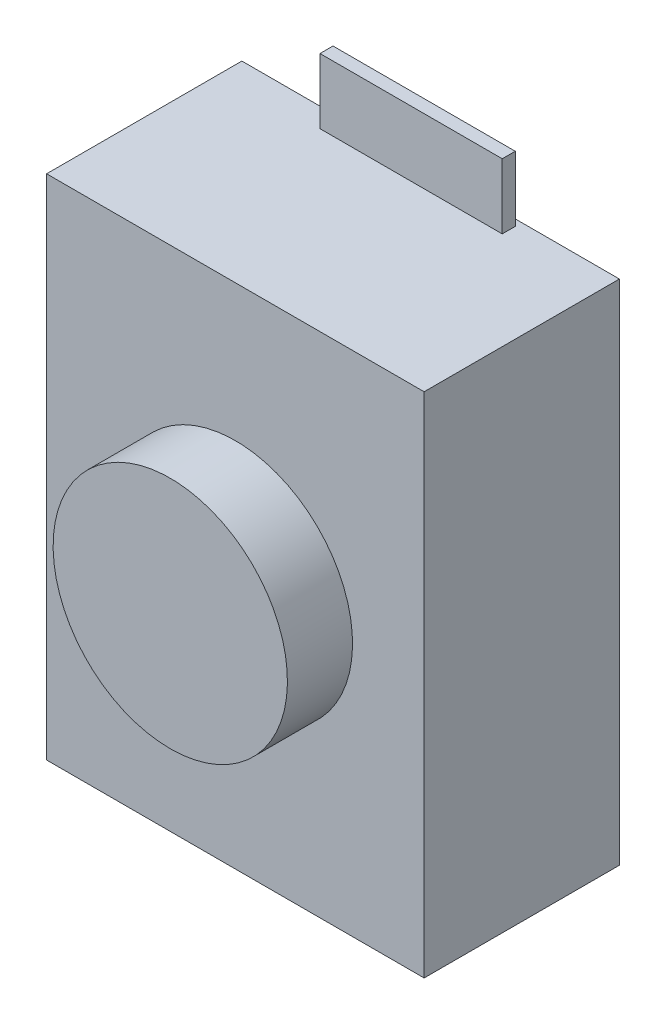
ISO-10303-21;
HEADER;
FILE_DESCRIPTION(('STEP AP214'),'2;1');
FILE_NAME('part.step','',(''),(''),'','','');
FILE_SCHEMA(('AUTOMOTIVE_DESIGN { 1 0 10303 214 1 1 1 1 }'));
ENDSEC;
DATA;
#1=APPLICATION_CONTEXT('core data for automotive mechanical design processes');
#2=APPLICATION_PROTOCOL_DEFINITION('international standard','automotive_design',2000,#1);
#3=PRODUCT_CONTEXT('',#1,'mechanical');
#4=PRODUCT('Part','Part','',(#3));
#5=PRODUCT_RELATED_PRODUCT_CATEGORY('part','',(#4));
#6=PRODUCT_DEFINITION_FORMATION('','',#4);
#7=PRODUCT_DEFINITION_CONTEXT('part definition',#1,'design');
#8=PRODUCT_DEFINITION('design','',#6,#7);
#9=PRODUCT_DEFINITION_SHAPE('','',#8);
#10=(LENGTH_UNIT() NAMED_UNIT(*) SI_UNIT(.MILLI.,.METRE.));
#11=(NAMED_UNIT(*) PLANE_ANGLE_UNIT() SI_UNIT($,.RADIAN.));
#12=(NAMED_UNIT(*) SI_UNIT($,.STERADIAN.) SOLID_ANGLE_UNIT());
#13=UNCERTAINTY_MEASURE_WITH_UNIT(LENGTH_MEASURE(1.E-05),#10,'distance_accuracy_value','');
#14=(GEOMETRIC_REPRESENTATION_CONTEXT(3) GLOBAL_UNCERTAINTY_ASSIGNED_CONTEXT((#13)) GLOBAL_UNIT_ASSIGNED_CONTEXT((#10,
#11,#12)) REPRESENTATION_CONTEXT('',''));
#15=CARTESIAN_POINT('',(0.,0.,0.));
#16=DIRECTION('',(0.,0.,1.));
#17=DIRECTION('',(1.,0.,0.));
#18=AXIS2_PLACEMENT_3D('',#15,#16,#17);
#19=CARTESIAN_POINT('',(56.15,-12.776,3.2));
#20=DIRECTION('',(0.,1.,0.));
#21=DIRECTION('',(1.,0.,0.));
#22=AXIS2_PLACEMENT_3D('',#19,#20,#21);
#23=PLANE('',#22);
#24=DIRECTION('',(0.,0.,1.));
#25=VECTOR('',#24,1.);
#26=CARTESIAN_POINT('',(59.05000000001,-12.77600000001,1.70000000001));
#27=LINE('',#26,#25);
#28=CARTESIAN_POINT('',(59.05,-12.776,1.7));
#29=VERTEX_POINT('',#28);
#30=CARTESIAN_POINT('',(59.05,-12.776,3.2));
#31=VERTEX_POINT('',#30);
#32=EDGE_CURVE('E11',#29,#31,#27,.T.);
#33=ORIENTED_EDGE('',*,*,#32,.T.);
#34=DIRECTION('',(-1.,0.,0.));
#35=VECTOR('',#34,1.);
#36=CARTESIAN_POINT('',(59.05000000001,-12.77600000001,3.20000000001));
#37=LINE('',#36,#35);
#38=CARTESIAN_POINT('',(56.15,-12.776,3.2));
#39=VERTEX_POINT('',#38);
#40=EDGE_CURVE('E28',#31,#39,#37,.T.);
#41=ORIENTED_EDGE('',*,*,#40,.T.);
#42=DIRECTION('',(0.,0.,1.));
#43=VECTOR('',#42,1.);
#44=CARTESIAN_POINT('',(56.15000000001,-12.77600000001,1.70000000001));
#45=LINE('',#44,#43);
#46=CARTESIAN_POINT('',(56.15,-12.776,1.7));
#47=VERTEX_POINT('',#46);
#48=EDGE_CURVE('E233',#47,#39,#45,.T.);
#49=ORIENTED_EDGE('',*,*,#48,.F.);
#50=DIRECTION('',(-1.,0.,0.));
#51=VECTOR('',#50,1.);
#52=CARTESIAN_POINT('',(59.05000000001,-12.77600000001,1.70000000001));
#53=LINE('',#52,#51);
#54=EDGE_CURVE('E133',#29,#47,#53,.T.);
#55=ORIENTED_EDGE('',*,*,#54,.F.);
#56=EDGE_LOOP('',(#33,#41,#49,#55));
#57=FACE_BOUND('',#56,.T.);
#58=DIRECTION('',(1.,0.,0.));
#59=VECTOR('',#58,1.);
#60=CARTESIAN_POINT('',(56.90000000001,-12.77600000001,1.75000000001));
#61=LINE('',#60,#59);
#62=CARTESIAN_POINT('',(56.9,-12.776,1.75));
#63=VERTEX_POINT('',#62);
#64=CARTESIAN_POINT('',(58.3,-12.776,1.75));
#65=VERTEX_POINT('',#64);
#66=EDGE_CURVE('E21',#63,#65,#61,.T.);
#67=ORIENTED_EDGE('',*,*,#66,.F.);
#68=DIRECTION('',(-1.00071054263569E-10,0.,1.));
#69=VECTOR('',#68,1.);
#70=CARTESIAN_POINT('',(56.90000000001,-12.77600000001,1.75000000001));
#71=LINE('',#70,#69);
#72=CARTESIAN_POINT('',(56.9,-12.776,1.85));
#73=VERTEX_POINT('',#72);
#74=EDGE_CURVE('E215',#63,#73,#71,.T.);
#75=ORIENTED_EDGE('',*,*,#74,.T.);
#76=DIRECTION('',(1.,0.,0.));
#77=VECTOR('',#76,1.);
#78=CARTESIAN_POINT('',(56.90000000001,-12.77600000001,1.85000000001));
#79=LINE('',#78,#77);
#80=CARTESIAN_POINT('',(58.3,-12.776,1.85));
#81=VERTEX_POINT('',#80);
#82=EDGE_CURVE('E211',#73,#81,#79,.T.);
#83=ORIENTED_EDGE('',*,*,#82,.T.);
#84=DIRECTION('',(-1.00071054263569E-10,0.,1.));
#85=VECTOR('',#84,1.);
#86=CARTESIAN_POINT('',(58.30000000001,-12.77600000001,1.75000000001));
#87=LINE('',#86,#85);
#88=EDGE_CURVE('E216',#65,#81,#87,.T.);
#89=ORIENTED_EDGE('',*,*,#88,.F.);
#90=EDGE_LOOP('',(#67,#75,#83,#89));
#91=FACE_BOUND('',#90,.T.);
#92=ADVANCED_FACE('F17',(#57,#91),#23,.F.);
#93=CARTESIAN_POINT('',(58.3,-13.276,1.85));
#94=DIRECTION('',(-1.,0.,0.));
#95=DIRECTION('',(0.,0.,1.));
#96=AXIS2_PLACEMENT_3D('',#93,#94,#95);
#97=PLANE('',#96);
#98=ORIENTED_EDGE('',*,*,#88,.T.);
#99=DIRECTION('',(-2.00142108543149E-11,-1.,0.));
#100=VECTOR('',#99,1.);
#101=CARTESIAN_POINT('',(58.30000000001,-12.77600000001,1.85000000001));
#102=LINE('',#101,#100);
#103=CARTESIAN_POINT('',(58.3,-13.276,1.85));
#104=VERTEX_POINT('',#103);
#105=EDGE_CURVE('E275',#81,#104,#102,.T.);
#106=ORIENTED_EDGE('',*,*,#105,.T.);
#107=DIRECTION('',(-1.00071054263569E-10,0.,1.));
#108=VECTOR('',#107,1.);
#109=CARTESIAN_POINT('',(58.30000000001,-13.27600000001,1.75000000001));
#110=LINE('',#109,#108);
#111=CARTESIAN_POINT('',(58.3,-13.276,1.75));
#112=VERTEX_POINT('',#111);
#113=EDGE_CURVE('E185',#112,#104,#110,.T.);
#114=ORIENTED_EDGE('',*,*,#113,.F.);
#115=DIRECTION('',(0.,-1.,0.));
#116=VECTOR('',#115,1.);
#117=CARTESIAN_POINT('',(58.30000000001,-12.77600000001,1.75000000001));
#118=LINE('',#117,#116);
#119=EDGE_CURVE('E223',#65,#112,#118,.T.);
#120=ORIENTED_EDGE('',*,*,#119,.F.);
#121=EDGE_LOOP('',(#98,#106,#114,#120));
#122=FACE_BOUND('',#121,.T.);
#123=ADVANCED_FACE('F328',(#122),#97,.F.);
#124=CARTESIAN_POINT('',(57.6,-10.826,1.75));
#125=DIRECTION('',(0.,0.,1.));
#126=DIRECTION('',(1.,0.,0.));
#127=AXIS2_PLACEMENT_3D('',#124,#125,#126);
#128=PLANE('',#127);
#129=DIRECTION('',(0.,1.,0.));
#130=VECTOR('',#129,1.);
#131=CARTESIAN_POINT('',(56.90000000001,-13.27600000001,1.75000000001));
#132=LINE('',#131,#130);
#133=CARTESIAN_POINT('',(56.9,-13.276,1.75));
#134=VERTEX_POINT('',#133);
#135=EDGE_CURVE('E246',#134,#63,#132,.T.);
#136=ORIENTED_EDGE('',*,*,#135,.T.);
#137=ORIENTED_EDGE('',*,*,#66,.T.);
#138=ORIENTED_EDGE('',*,*,#119,.T.);
#139=DIRECTION('',(-1.,0.,0.));
#140=VECTOR('',#139,1.);
#141=CARTESIAN_POINT('',(58.30000000001,-13.27600000001,1.75000000001));
#142=LINE('',#141,#140);
#143=EDGE_CURVE('E202',#112,#134,#142,.T.);
#144=ORIENTED_EDGE('',*,*,#143,.T.);
#145=EDGE_LOOP('',(#136,#137,#138,#144));
#146=FACE_BOUND('',#145,.T.);
#147=ADVANCED_FACE('F319',(#146),#128,.F.);
#148=CARTESIAN_POINT('',(56.9,-13.276,1.85));
#149=DIRECTION('',(0.,1.,0.));
#150=DIRECTION('',(1.,0.,0.));
#151=AXIS2_PLACEMENT_3D('',#148,#149,#150);
#152=PLANE('',#151);
#153=ORIENTED_EDGE('',*,*,#113,.T.);
#154=DIRECTION('',(-1.,0.,0.));
#155=VECTOR('',#154,1.);
#156=CARTESIAN_POINT('',(58.30000000001,-13.27600000001,1.85000000001));
#157=LINE('',#156,#155);
#158=CARTESIAN_POINT('',(56.9,-13.276,1.85));
#159=VERTEX_POINT('',#158);
#160=EDGE_CURVE('E172',#104,#159,#157,.T.);
#161=ORIENTED_EDGE('',*,*,#160,.T.);
#162=DIRECTION('',(-1.00071054263569E-10,0.,1.));
#163=VECTOR('',#162,1.);
#164=CARTESIAN_POINT('',(56.90000000001,-13.27600000001,1.75000000001));
#165=LINE('',#164,#163);
#166=EDGE_CURVE('E164',#134,#159,#165,.T.);
#167=ORIENTED_EDGE('',*,*,#166,.F.);
#168=ORIENTED_EDGE('',*,*,#143,.F.);
#169=EDGE_LOOP('',(#153,#161,#167,#168));
#170=FACE_BOUND('',#169,.T.);
#171=ADVANCED_FACE('F331',(#170),#152,.F.);
#172=CARTESIAN_POINT('',(56.9,-12.776,1.85));
#173=DIRECTION('',(1.,0.,0.));
#174=DIRECTION('',(0.,1.,0.));
#175=AXIS2_PLACEMENT_3D('',#172,#173,#174);
#176=PLANE('',#175);
#177=ORIENTED_EDGE('',*,*,#166,.T.);
#178=DIRECTION('',(-2.00142108543149E-11,1.,0.));
#179=VECTOR('',#178,1.);
#180=CARTESIAN_POINT('',(56.90000000001,-13.27600000001,1.85000000001));
#181=LINE('',#180,#179);
#182=EDGE_CURVE('E161',#159,#73,#181,.T.);
#183=ORIENTED_EDGE('',*,*,#182,.T.);
#184=ORIENTED_EDGE('',*,*,#74,.F.);
#185=ORIENTED_EDGE('',*,*,#135,.F.);
#186=EDGE_LOOP('',(#177,#183,#184,#185));
#187=FACE_BOUND('',#186,.T.);
#188=ADVANCED_FACE('F318',(#187),#176,.F.);
#189=CARTESIAN_POINT('',(57.6,-10.826,1.85));
#190=DIRECTION('',(0.,0.,1.));
#191=DIRECTION('',(1.,0.,0.));
#192=AXIS2_PLACEMENT_3D('',#189,#190,#191);
#193=PLANE('',#192);
#194=ORIENTED_EDGE('',*,*,#105,.F.);
#195=ORIENTED_EDGE('',*,*,#82,.F.);
#196=ORIENTED_EDGE('',*,*,#182,.F.);
#197=ORIENTED_EDGE('',*,*,#160,.F.);
#198=EDGE_LOOP('',(#194,#195,#196,#197));
#199=FACE_BOUND('',#198,.T.);
#200=ADVANCED_FACE('F329',(#199),#193,.T.);
#201=CARTESIAN_POINT('',(57.6,-10.826,1.7));
#202=DIRECTION('',(0.,0.,1.));
#203=DIRECTION('',(1.,0.,0.));
#204=AXIS2_PLACEMENT_3D('',#201,#202,#203);
#205=PLANE('',#204);
#206=DIRECTION('',(0.,1.,0.));
#207=VECTOR('',#206,1.);
#208=CARTESIAN_POINT('',(56.15000000001,-12.77600000001,1.70000000001));
#209=LINE('',#208,#207);
#210=CARTESIAN_POINT('',(56.15,-8.876,1.7));
#211=VERTEX_POINT('',#210);
#212=EDGE_CURVE('E138',#47,#211,#209,.T.);
#213=ORIENTED_EDGE('',*,*,#212,.T.);
#214=DIRECTION('',(1.,0.,0.));
#215=VECTOR('',#214,1.);
#216=CARTESIAN_POINT('',(56.15000000001,-8.87600000001,1.70000000001));
#217=LINE('',#216,#215);
#218=CARTESIAN_POINT('',(59.05,-8.876,1.7));
#219=VERTEX_POINT('',#218);
#220=EDGE_CURVE('E132',#211,#219,#217,.T.);
#221=ORIENTED_EDGE('',*,*,#220,.T.);
#222=DIRECTION('',(0.,-1.,0.));
#223=VECTOR('',#222,1.);
#224=CARTESIAN_POINT('',(59.05000000001,-8.87600000001,1.70000000001));
#225=LINE('',#224,#223);
#226=EDGE_CURVE('E123',#219,#29,#225,.T.);
#227=ORIENTED_EDGE('',*,*,#226,.T.);
#228=ORIENTED_EDGE('',*,*,#54,.T.);
#229=EDGE_LOOP('',(#213,#221,#227,#228));
#230=FACE_BOUND('',#229,.T.);
#231=ADVANCED_FACE('F136',(#230),#205,.F.);
#232=CARTESIAN_POINT('',(59.05,-12.776,3.2));
#233=DIRECTION('',(-1.,0.,0.));
#234=DIRECTION('',(0.,0.,1.));
#235=AXIS2_PLACEMENT_3D('',#232,#233,#234);
#236=PLANE('',#235);
#237=DIRECTION('',(0.,0.,1.));
#238=VECTOR('',#237,1.);
#239=CARTESIAN_POINT('',(59.05000000001,-8.87600000001,1.70000000001));
#240=LINE('',#239,#238);
#241=CARTESIAN_POINT('',(59.05,-8.876,3.2));
#242=VERTEX_POINT('',#241);
#243=EDGE_CURVE('E128',#219,#242,#240,.T.);
#244=ORIENTED_EDGE('',*,*,#243,.T.);
#245=DIRECTION('',(0.,-1.,0.));
#246=VECTOR('',#245,1.);
#247=CARTESIAN_POINT('',(59.05000000001,-8.87600000001,3.20000000001));
#248=LINE('',#247,#246);
#249=EDGE_CURVE('E146',#242,#31,#248,.T.);
#250=ORIENTED_EDGE('',*,*,#249,.T.);
#251=ORIENTED_EDGE('',*,*,#32,.F.);
#252=ORIENTED_EDGE('',*,*,#226,.F.);
#253=EDGE_LOOP('',(#244,#250,#251,#252));
#254=FACE_BOUND('',#253,.T.);
#255=ADVANCED_FACE('F125',(#254),#236,.F.);
#256=CARTESIAN_POINT('',(57.6,-10.826,3.2));
#257=DIRECTION('',(0.,0.,1.));
#258=DIRECTION('',(1.,0.,0.));
#259=AXIS2_PLACEMENT_3D('',#256,#257,#258);
#260=PLANE('',#259);
#261=ORIENTED_EDGE('',*,*,#249,.F.);
#262=DIRECTION('',(1.,0.,0.));
#263=VECTOR('',#262,1.);
#264=CARTESIAN_POINT('',(56.15000000001,-8.87600000001,3.20000000001));
#265=LINE('',#264,#263);
#266=CARTESIAN_POINT('',(56.15,-8.876,3.2));
#267=VERTEX_POINT('',#266);
#268=EDGE_CURVE('E89',#267,#242,#265,.T.);
#269=ORIENTED_EDGE('',*,*,#268,.F.);
#270=DIRECTION('',(0.,1.,0.));
#271=VECTOR('',#270,1.);
#272=CARTESIAN_POINT('',(56.15000000001,-12.77600000001,3.20000000001));
#273=LINE('',#272,#271);
#274=EDGE_CURVE('E238',#39,#267,#273,.T.);
#275=ORIENTED_EDGE('',*,*,#274,.F.);
#276=ORIENTED_EDGE('',*,*,#40,.F.);
#277=EDGE_LOOP('',(#261,#269,#275,#276));
#278=FACE_BOUND('',#277,.T.);
#279=CARTESIAN_POINT('',(57.60000000001,-10.82600000001,3.20000000001));
#280=DIRECTION('',(0.,0.,-1.));
#281=DIRECTION('',(0.,-1.,0.));
#282=AXIS2_PLACEMENT_3D('',#279,#280,#281);
#283=CIRCLE('',#282,0.90000000001);
#284=CARTESIAN_POINT('',(57.60000000001,-11.72600000002,3.20000000001));
#285=VERTEX_POINT('',#284);
#286=EDGE_CURVE('E151',#285,#285,#283,.T.);
#287=ORIENTED_EDGE('',*,*,#286,.T.);
#288=EDGE_LOOP('',(#287));
#289=FACE_BOUND('',#288,.T.);
#290=ADVANCED_FACE('F366',(#278,#289),#260,.T.);
#291=CARTESIAN_POINT('',(57.6,-10.826,3.7));
#292=DIRECTION('',(0.,0.,-1.));
#293=DIRECTION('',(0.,-1.,0.));
#294=AXIS2_PLACEMENT_3D('',#291,#292,#293);
#295=CYLINDRICAL_SURFACE('',#294,0.9);
#296=ORIENTED_EDGE('',*,*,#286,.F.);
#297=EDGE_LOOP('',(#296));
#298=FACE_BOUND('',#297,.T.);
#299=CARTESIAN_POINT('',(57.60000000001,-10.82600000001,3.70000000001));
#300=DIRECTION('',(0.,0.,1.));
#301=DIRECTION('',(0.,-1.,0.));
#302=AXIS2_PLACEMENT_3D('',#299,#300,#301);
#303=CIRCLE('',#302,0.90000000001);
#304=CARTESIAN_POINT('',(57.60000000001,-11.72600000002,3.70000000001));
#305=VERTEX_POINT('',#304);
#306=EDGE_CURVE('E189',#305,#305,#303,.T.);
#307=ORIENTED_EDGE('',*,*,#306,.F.);
#308=EDGE_LOOP('',(#307));
#309=FACE_BOUND('',#308,.T.);
#310=ADVANCED_FACE('F369',(#298,#309),#295,.T.);
#311=CARTESIAN_POINT('',(57.6,-10.826,3.7));
#312=DIRECTION('',(0.,0.,1.));
#313=DIRECTION('',(1.,0.,0.));
#314=AXIS2_PLACEMENT_3D('',#311,#312,#313);
#315=PLANE('',#314);
#316=ORIENTED_EDGE('',*,*,#306,.T.);
#317=EDGE_LOOP('',(#316));
#318=FACE_BOUND('',#317,.T.);
#319=ADVANCED_FACE('F19',(#318),#315,.T.);
#320=CARTESIAN_POINT('',(56.15,-8.876,3.2));
#321=DIRECTION('',(1.,0.,0.));
#322=DIRECTION('',(0.,1.,0.));
#323=AXIS2_PLACEMENT_3D('',#320,#321,#322);
#324=PLANE('',#323);
#325=ORIENTED_EDGE('',*,*,#48,.T.);
#326=ORIENTED_EDGE('',*,*,#274,.T.);
#327=DIRECTION('',(0.,0.,1.));
#328=VECTOR('',#327,1.);
#329=CARTESIAN_POINT('',(56.15000000001,-8.87600000001,1.70000000001));
#330=LINE('',#329,#328);
#331=EDGE_CURVE('E222',#211,#267,#330,.T.);
#332=ORIENTED_EDGE('',*,*,#331,.F.);
#333=ORIENTED_EDGE('',*,*,#212,.F.);
#334=EDGE_LOOP('',(#325,#326,#332,#333));
#335=FACE_BOUND('',#334,.T.);
#336=ADVANCED_FACE('F363',(#335),#324,.F.);
#337=CARTESIAN_POINT('',(59.05,-8.876,3.2));
#338=DIRECTION('',(0.,-1.,0.));
#339=DIRECTION('',(0.,0.,-1.));
#340=AXIS2_PLACEMENT_3D('',#337,#338,#339);
#341=PLANE('',#340);
#342=ORIENTED_EDGE('',*,*,#331,.T.);
#343=ORIENTED_EDGE('',*,*,#268,.T.);
#344=ORIENTED_EDGE('',*,*,#243,.F.);
#345=ORIENTED_EDGE('',*,*,#220,.F.);
#346=EDGE_LOOP('',(#342,#343,#344,#345));
#347=FACE_BOUND('',#346,.T.);
#348=DIRECTION('',(-1.,0.,0.));
#349=VECTOR('',#348,1.);
#350=CARTESIAN_POINT('',(58.30000000001,-8.87600000001,1.75000000001));
#351=LINE('',#350,#349);
#352=CARTESIAN_POINT('',(58.3,-8.876,1.75));
#353=VERTEX_POINT('',#352);
#354=CARTESIAN_POINT('',(56.9,-8.876,1.75));
#355=VERTEX_POINT('',#354);
#356=EDGE_CURVE('E99',#353,#355,#351,.T.);
#357=ORIENTED_EDGE('',*,*,#356,.F.);
#358=DIRECTION('',(-1.00071054263569E-10,0.,1.));
#359=VECTOR('',#358,1.);
#360=CARTESIAN_POINT('',(58.30000000001,-8.87600000001,1.75000000001));
#361=LINE('',#360,#359);
#362=CARTESIAN_POINT('',(58.3,-8.876,1.85));
#363=VERTEX_POINT('',#362);
#364=EDGE_CURVE('E190',#353,#363,#361,.T.);
#365=ORIENTED_EDGE('',*,*,#364,.T.);
#366=DIRECTION('',(-1.,0.,0.));
#367=VECTOR('',#366,1.);
#368=CARTESIAN_POINT('',(58.30000000001,-8.87600000001,1.85000000001));
#369=LINE('',#368,#367);
#370=CARTESIAN_POINT('',(56.9,-8.876,1.85));
#371=VERTEX_POINT('',#370);
#372=EDGE_CURVE('E193',#363,#371,#369,.T.);
#373=ORIENTED_EDGE('',*,*,#372,.T.);
#374=DIRECTION('',(-1.00071054263569E-10,0.,1.));
#375=VECTOR('',#374,1.);
#376=CARTESIAN_POINT('',(56.90000000001,-8.87600000001,1.75000000001));
#377=LINE('',#376,#375);
#378=EDGE_CURVE('E210',#355,#371,#377,.T.);
#379=ORIENTED_EDGE('',*,*,#378,.F.);
#380=EDGE_LOOP('',(#357,#365,#373,#379));
#381=FACE_BOUND('',#380,.T.);
#382=ADVANCED_FACE('F144',(#347,#381),#341,.F.);
#383=CARTESIAN_POINT('',(56.9,-8.376,1.85));
#384=DIRECTION('',(1.,0.,0.));
#385=DIRECTION('',(0.,1.,0.));
#386=AXIS2_PLACEMENT_3D('',#383,#384,#385);
#387=PLANE('',#386);
#388=ORIENTED_EDGE('',*,*,#378,.T.);
#389=DIRECTION('',(-2.00142108543149E-11,1.,0.));
#390=VECTOR('',#389,1.);
#391=CARTESIAN_POINT('',(56.90000000001,-8.87600000001,1.85000000001));
#392=LINE('',#391,#390);
#393=CARTESIAN_POINT('',(56.9,-8.376,1.85));
#394=VERTEX_POINT('',#393);
#395=EDGE_CURVE('E256',#371,#394,#392,.T.);
#396=ORIENTED_EDGE('',*,*,#395,.T.);
#397=DIRECTION('',(-1.00071054263569E-10,0.,1.));
#398=VECTOR('',#397,1.);
#399=CARTESIAN_POINT('',(56.90000000001,-8.37600000001,1.75000000001));
#400=LINE('',#399,#398);
#401=CARTESIAN_POINT('',(56.9,-8.376,1.75));
#402=VERTEX_POINT('',#401);
#403=EDGE_CURVE('E206',#402,#394,#400,.T.);
#404=ORIENTED_EDGE('',*,*,#403,.F.);
#405=DIRECTION('',(0.,1.,0.));
#406=VECTOR('',#405,1.);
#407=CARTESIAN_POINT('',(56.90000000001,-8.87600000001,1.75000000001));
#408=LINE('',#407,#406);
#409=EDGE_CURVE('E198',#355,#402,#408,.T.);
#410=ORIENTED_EDGE('',*,*,#409,.F.);
#411=EDGE_LOOP('',(#388,#396,#404,#410));
#412=FACE_BOUND('',#411,.T.);
#413=ADVANCED_FACE('F287',(#412),#387,.F.);
#414=ORIENTED_EDGE('',*,*,#409,.T.);
#415=DIRECTION('',(1.,0.,0.));
#416=VECTOR('',#415,1.);
#417=CARTESIAN_POINT('',(56.90000000001,-8.37600000001,1.75000000001));
#418=LINE('',#417,#416);
#419=CARTESIAN_POINT('',(58.3,-8.376,1.75));
#420=VERTEX_POINT('',#419);
#421=EDGE_CURVE('E194',#402,#420,#418,.T.);
#422=ORIENTED_EDGE('',*,*,#421,.T.);
#423=DIRECTION('',(0.,-1.,0.));
#424=VECTOR('',#423,1.);
#425=CARTESIAN_POINT('',(58.30000000001,-8.37600000001,1.75000000001));
#426=LINE('',#425,#424);
#427=EDGE_CURVE('E199',#420,#353,#426,.T.);
#428=ORIENTED_EDGE('',*,*,#427,.T.);
#429=ORIENTED_EDGE('',*,*,#356,.T.);
#430=EDGE_LOOP('',(#414,#422,#428,#429));
#431=FACE_BOUND('',#430,.T.);
#432=ADVANCED_FACE('F279',(#431),#128,.F.);
#433=CARTESIAN_POINT('',(58.3,-8.876,1.85));
#434=DIRECTION('',(-1.,0.,0.));
#435=DIRECTION('',(0.,0.,1.));
#436=AXIS2_PLACEMENT_3D('',#433,#434,#435);
#437=PLANE('',#436);
#438=DIRECTION('',(-1.00071054263569E-10,0.,1.));
#439=VECTOR('',#438,1.);
#440=CARTESIAN_POINT('',(58.30000000001,-8.37600000001,1.75000000001));
#441=LINE('',#440,#439);
#442=CARTESIAN_POINT('',(58.3,-8.376,1.85));
#443=VERTEX_POINT('',#442);
#444=EDGE_CURVE('E156',#420,#443,#441,.T.);
#445=ORIENTED_EDGE('',*,*,#444,.T.);
#446=DIRECTION('',(-2.00142108543149E-11,-1.,0.));
#447=VECTOR('',#446,1.);
#448=CARTESIAN_POINT('',(58.30000000001,-8.37600000001,1.85000000001));
#449=LINE('',#448,#447);
#450=EDGE_CURVE('E160',#443,#363,#449,.T.);
#451=ORIENTED_EDGE('',*,*,#450,.T.);
#452=ORIENTED_EDGE('',*,*,#364,.F.);
#453=ORIENTED_EDGE('',*,*,#427,.F.);
#454=EDGE_LOOP('',(#445,#451,#452,#453));
#455=FACE_BOUND('',#454,.T.);
#456=ADVANCED_FACE('F294',(#455),#437,.F.);
#457=ORIENTED_EDGE('',*,*,#450,.F.);
#458=DIRECTION('',(1.,0.,0.));
#459=VECTOR('',#458,1.);
#460=CARTESIAN_POINT('',(56.90000000001,-8.37600000001,1.85000000001));
#461=LINE('',#460,#459);
#462=EDGE_CURVE('E248',#394,#443,#461,.T.);
#463=ORIENTED_EDGE('',*,*,#462,.F.);
#464=ORIENTED_EDGE('',*,*,#395,.F.);
#465=ORIENTED_EDGE('',*,*,#372,.F.);
#466=EDGE_LOOP('',(#457,#463,#464,#465));
#467=FACE_BOUND('',#466,.T.);
#468=ADVANCED_FACE('F371',(#467),#193,.T.);
#469=CARTESIAN_POINT('',(58.3,-8.376,1.85));
#470=DIRECTION('',(0.,-1.,0.));
#471=DIRECTION('',(0.,0.,-1.));
#472=AXIS2_PLACEMENT_3D('',#469,#470,#471);
#473=PLANE('',#472);
#474=ORIENTED_EDGE('',*,*,#403,.T.);
#475=ORIENTED_EDGE('',*,*,#462,.T.);
#476=ORIENTED_EDGE('',*,*,#444,.F.);
#477=ORIENTED_EDGE('',*,*,#421,.F.);
#478=EDGE_LOOP('',(#474,#475,#476,#477));
#479=FACE_BOUND('',#478,.T.);
#480=ADVANCED_FACE('F291',(#479),#473,.F.);
#481=CLOSED_SHELL('',(#92,#123,#147,#171,#188,#200,#231,#255,#290,#310,#319,#336,#382,#413,#432,
#456,#468,#480));
#482=MANIFOLD_SOLID_BREP('B1',#481);
#483=ADVANCED_BREP_SHAPE_REPRESENTATION('',(#18,#482),#14);
#484=SHAPE_DEFINITION_REPRESENTATION(#9,#483);
ENDSEC;
END-ISO-10303-21;
